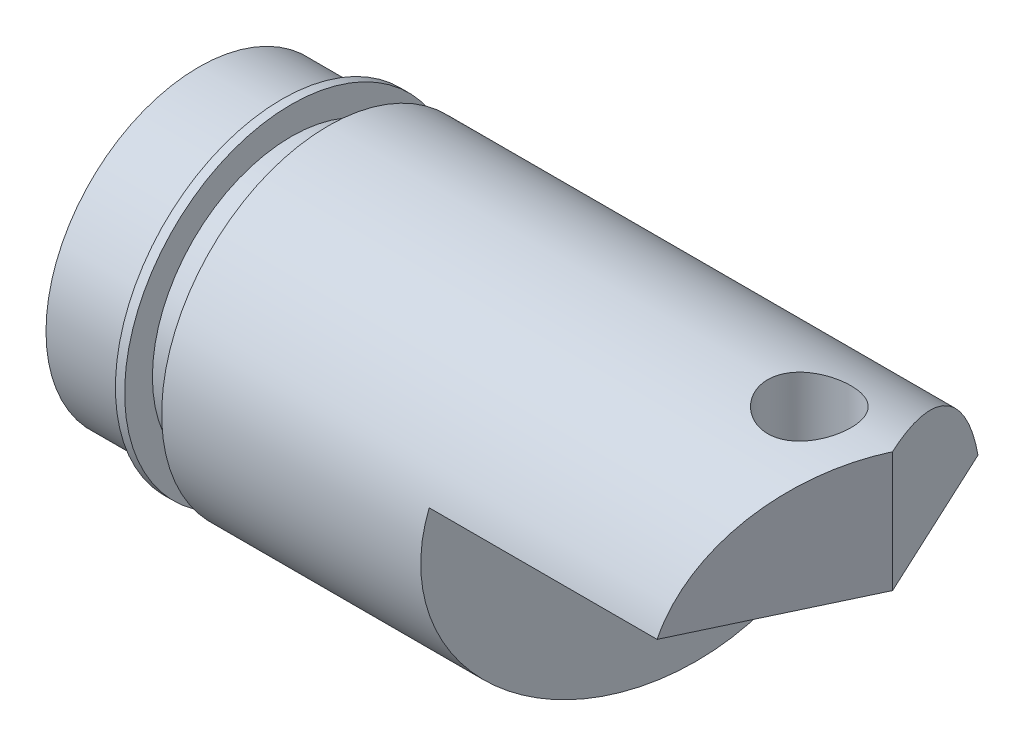
ISO-10303-21;
HEADER;
FILE_DESCRIPTION(('STEP AP214'),'2;1');
FILE_NAME('part.step','',(''),(''),'','','');
FILE_SCHEMA(('AUTOMOTIVE_DESIGN { 1 0 10303 214 1 1 1 1 }'));
ENDSEC;
DATA;
#1=APPLICATION_CONTEXT('core data for automotive mechanical design processes');
#2=APPLICATION_PROTOCOL_DEFINITION('international standard','automotive_design',2000,#1);
#3=PRODUCT_CONTEXT('',#1,'mechanical');
#4=PRODUCT('Part','Part','',(#3));
#5=PRODUCT_RELATED_PRODUCT_CATEGORY('part','',(#4));
#6=PRODUCT_DEFINITION_FORMATION('','',#4);
#7=PRODUCT_DEFINITION_CONTEXT('part definition',#1,'design');
#8=PRODUCT_DEFINITION('design','',#6,#7);
#9=PRODUCT_DEFINITION_SHAPE('','',#8);
#10=(LENGTH_UNIT() NAMED_UNIT(*) SI_UNIT(.MILLI.,.METRE.));
#11=(NAMED_UNIT(*) PLANE_ANGLE_UNIT() SI_UNIT($,.RADIAN.));
#12=(NAMED_UNIT(*) SI_UNIT($,.STERADIAN.) SOLID_ANGLE_UNIT());
#13=UNCERTAINTY_MEASURE_WITH_UNIT(LENGTH_MEASURE(1.E-05),#10,'distance_accuracy_value','');
#14=(GEOMETRIC_REPRESENTATION_CONTEXT(3) GLOBAL_UNCERTAINTY_ASSIGNED_CONTEXT((#13)) GLOBAL_UNIT_ASSIGNED_CONTEXT((#10,
#11,#12)) REPRESENTATION_CONTEXT('',''));
#15=CARTESIAN_POINT('',(0.,0.,0.));
#16=DIRECTION('',(0.,0.,1.));
#17=DIRECTION('',(1.,0.,0.));
#18=AXIS2_PLACEMENT_3D('',#15,#16,#17);
#19=CARTESIAN_POINT('',(150.,0.,0.));
#20=DIRECTION('',(1.,0.,0.));
#21=DIRECTION('',(0.,1.,0.));
#22=AXIS2_PLACEMENT_3D('',#19,#20,#21);
#23=CYLINDRICAL_SURFACE('',#22,36.);
#24=CARTESIAN_POINT('',(28.,0.,0.));
#25=DIRECTION('',(1.,0.,0.));
#26=DIRECTION('',(0.,1.,0.));
#27=AXIS2_PLACEMENT_3D('',#24,#25,#26);
#28=CIRCLE('',#27,36.);
#29=CARTESIAN_POINT('',(28.,36.,0.));
#30=VERTEX_POINT('',#29);
#31=EDGE_CURVE('E153',#30,#30,#28,.T.);
#32=ORIENTED_EDGE('',*,*,#31,.T.);
#33=EDGE_LOOP('',(#32));
#34=FACE_BOUND('',#33,.T.);
#35=CARTESIAN_POINT('',(123.,36.,0.));
#36=CARTESIAN_POINT('',(122.999992576533,36.0000044944164,-0.248708081107665));
#37=CARTESIAN_POINT('',(123.010310812333,35.997418850588,-0.497334927134101));
#38=CARTESIAN_POINT('',(123.05147979303,35.9871583606073,-0.992847512259112));
#39=CARTESIAN_POINT('',(123.082332880576,35.9794829338048,-1.23973304945848));
#40=CARTESIAN_POINT('',(123.164333573675,35.9592469135092,-1.72997199200645));
#41=CARTESIAN_POINT('',(123.215487472476,35.9466848051694,-1.97332427777547));
#42=CARTESIAN_POINT('',(123.337685873163,35.9170178569353,-2.45479492762603));
#43=CARTESIAN_POINT('',(123.408737711148,35.8999113416994,-2.69291132631911));
#44=CARTESIAN_POINT('',(123.570025589268,35.8616556614565,-3.16178775744111));
#45=CARTESIAN_POINT('',(123.660230807632,35.8405129969048,-3.39255893184381));
#46=CARTESIAN_POINT('',(123.859237553525,35.7947291894823,-3.8456782092311));
#47=CARTESIAN_POINT('',(123.968046042567,35.770086737546,-4.06802312084179));
#48=CARTESIAN_POINT('',(124.203389323214,35.7179784089056,-4.50265606051845));
#49=CARTESIAN_POINT('',(124.329916893428,35.6905136836236,-4.71494813867445));
#50=CARTESIAN_POINT('',(124.59990594184,35.6334671347439,-5.12831149613846));
#51=CARTESIAN_POINT('',(124.743375156719,35.6038843463445,-5.3293775867044));
#52=CARTESIAN_POINT('',(125.049040722956,35.5428333520078,-5.72252606101568));
#53=CARTESIAN_POINT('',(125.211534335297,35.5113403957843,-5.91437353986337));
#54=CARTESIAN_POINT('',(125.551872269155,35.4478549541394,-6.2836834894836));
#55=CARTESIAN_POINT('',(125.729709949448,35.4158626896911,-6.46115211985998));
#56=CARTESIAN_POINT('',(126.099727053217,35.3522276034191,-6.80072543740274));
#57=CARTESIAN_POINT('',(126.291913878228,35.3205849717377,-6.96282209620906));
#58=CARTESIAN_POINT('',(126.689224888148,35.2585571516821,-7.27040301697814));
#59=CARTESIAN_POINT('',(126.894344206234,35.2281714973212,-7.41589347102691));
#60=CARTESIAN_POINT('',(127.319482001813,35.1690527920878,-7.69141658700408));
#61=CARTESIAN_POINT('',(127.539680327774,35.1403521113973,-7.82117889987807));
#62=CARTESIAN_POINT('',(127.990522760713,35.0859781338499,-8.06159605565789));
#63=CARTESIAN_POINT('',(128.221162809222,35.0603036745144,-8.17225824323167));
#64=CARTESIAN_POINT('',(128.691379804367,35.0127442983362,-8.37367623614701));
#65=CARTESIAN_POINT('',(128.930957416218,34.9908596642538,-8.46443055629025));
#66=CARTESIAN_POINT('',(129.417309435166,34.9515601365013,-8.62527138426578));
#67=CARTESIAN_POINT('',(129.66408366972,34.9341451357671,-8.69535838716212));
#68=CARTESIAN_POINT('',(130.158003799092,34.9046329762828,-8.81307024625773));
#69=CARTESIAN_POINT('',(130.405043254017,34.8924362928045,-8.86111688015349));
#70=CARTESIAN_POINT('',(130.902476907251,34.8732389901334,-8.93637036715465));
#71=CARTESIAN_POINT('',(131.152871064852,34.8662383079481,-8.96357747290344));
#72=CARTESIAN_POINT('',(131.655115789811,34.8576521123172,-8.99690984404975));
#73=CARTESIAN_POINT('',(131.906966145298,34.8560658300219,-9.00303810266389));
#74=CARTESIAN_POINT('',(132.410267532501,34.8583561873088,-8.99416620227556));
#75=CARTESIAN_POINT('',(132.66171856972,34.8622327509305,-8.97916633705787));
#76=CARTESIAN_POINT('',(133.156210905136,34.8751663308839,-8.92879753627707));
#77=CARTESIAN_POINT('',(133.399307457731,34.8840943046791,-8.89393583920132));
#78=CARTESIAN_POINT('',(133.881709783103,34.9067723910135,-8.80450832611612));
#79=CARTESIAN_POINT('',(134.121014157804,34.9205242406588,-8.74993541177104));
#80=CARTESIAN_POINT('',(134.59405540334,34.9524453610949,-8.62153887898529));
#81=CARTESIAN_POINT('',(134.827793133983,34.9706139447673,-8.54771825481312));
#82=CARTESIAN_POINT('',(135.288184650311,35.0108492027718,-8.38139323227782));
#83=CARTESIAN_POINT('',(135.514838114114,35.0329160539243,-8.28888798637782));
#84=CARTESIAN_POINT('',(135.961813717021,35.0805656562831,-8.08486184192219));
#85=CARTESIAN_POINT('',(136.182049344485,35.1061815104471,-7.97315919624307));
#86=CARTESIAN_POINT('',(136.612364210327,35.1600387506006,-7.73219945063622));
#87=CARTESIAN_POINT('',(136.822443181354,35.1882802056464,-7.60294188895341));
#88=CARTESIAN_POINT('',(137.231142086715,35.2466158106245,-7.32774541133855));
#89=CARTESIAN_POINT('',(137.4297604731,35.2767102096995,-7.18180424989685));
#90=CARTESIAN_POINT('',(137.814271240451,35.3379359281938,-6.87421762063127));
#91=CARTESIAN_POINT('',(138.000163370913,35.3690672680063,-6.71257184382928));
#92=CARTESIAN_POINT('',(138.363173147926,35.4324303446844,-6.36978113050947));
#93=CARTESIAN_POINT('',(138.539888688096,35.4646681200777,-6.18821121181492));
#94=CARTESIAN_POINT('',(138.877440728774,35.528463439825,-5.81075838224585));
#95=CARTESIAN_POINT('',(139.038277296155,35.5600209870432,-5.6148755316553));
#96=CARTESIAN_POINT('',(139.342977953453,35.6215812890947,-5.21007238720521));
#97=CARTESIAN_POINT('',(139.486840910727,35.6515839400955,-5.0011512247248));
#98=CARTESIAN_POINT('',(139.756548223857,35.7091959905674,-4.57167947950408));
#99=CARTESIAN_POINT('',(139.882393254696,35.7368054796755,-4.35112933283051));
#100=CARTESIAN_POINT('',(140.115560275182,35.7889557320666,-3.89905149634634));
#101=CARTESIAN_POINT('',(140.222812305072,35.813484813278,-3.66748635232867));
#102=CARTESIAN_POINT('',(140.417339077324,35.8586481118262,-3.1958482586732));
#103=CARTESIAN_POINT('',(140.504621696191,35.8792838642378,-2.9557787067146));
#104=CARTESIAN_POINT('',(140.658547079378,35.9160806273048,-2.4687616040537));
#105=CARTESIAN_POINT('',(140.725188921551,35.9322414380345,-2.22181374659376));
#106=CARTESIAN_POINT('',(140.837253438622,35.9596175006157,-1.72288121573351));
#107=CARTESIAN_POINT('',(140.882676636658,35.9708328743945,-1.47089666667044));
#108=CARTESIAN_POINT('',(140.951017024578,35.9877707026607,-0.970294266785835));
#109=CARTESIAN_POINT('',(140.974480676372,35.9936264444568,-0.721755405302816));
#110=CARTESIAN_POINT('',(141.000681408636,36.0001680935616,-0.223521283164617));
#111=CARTESIAN_POINT('',(141.003418842699,36.0008540890671,0.0261739576897887));
#112=CARTESIAN_POINT('',(140.988144559454,35.997037224875,0.52486719008658));
#113=CARTESIAN_POINT('',(140.970134562504,35.9925347953969,0.773865237723523));
#114=CARTESIAN_POINT('',(140.913523269726,35.9784678199642,1.2693632222676));
#115=CARTESIAN_POINT('',(140.874922054408,35.9689032938019,1.51586316893823));
#116=CARTESIAN_POINT('',(140.778189714055,35.9451589919469,2.00090506817892));
#117=CARTESIAN_POINT('',(140.720361034563,35.9310507893372,2.23951094987882));
#118=CARTESIAN_POINT('',(140.585483293455,35.8985548611742,2.71101953711379));
#119=CARTESIAN_POINT('',(140.508427282619,35.8801655885007,2.94392014713149));
#120=CARTESIAN_POINT('',(140.335725577707,35.8396049466392,3.40230033622135));
#121=CARTESIAN_POINT('',(140.240085379678,35.8174346958665,3.62778208633466));
#122=CARTESIAN_POINT('',(140.030868653575,35.7698822335708,4.07001336809315));
#123=CARTESIAN_POINT('',(139.917285290557,35.744498798811,4.28675953251289));
#124=CARTESIAN_POINT('',(139.670892422831,35.6907255679094,4.71372564822919));
#125=CARTESIAN_POINT('',(139.537783869451,35.6622912987979,4.92376743082101));
#126=CARTESIAN_POINT('',(139.254728672287,35.6035380116113,5.33203934959501));
#127=CARTESIAN_POINT('',(139.104774442285,35.5732181471503,5.5302641021367));
#128=CARTESIAN_POINT('',(138.789059998823,35.511510420342,5.91357111708696));
#129=CARTESIAN_POINT('',(138.623297391244,35.4801223966906,6.09865138138459));
#130=CARTESIAN_POINT('',(138.277141381833,35.4171365103224,6.45438329043657));
#131=CARTESIAN_POINT('',(138.096754304922,35.3855387436885,6.625041108204));
#132=CARTESIAN_POINT('',(137.717750793312,35.3221872127429,6.95499967347827));
#133=CARTESIAN_POINT('',(137.518791308996,35.2904493060001,7.11390970868787));
#134=CARTESIAN_POINT('',(137.108041611164,35.2285522319199,7.41435316391705));
#135=CARTESIAN_POINT('',(136.896256177882,35.1983924841195,7.55589299901275));
#136=CARTESIAN_POINT('',(136.46112296814,35.1405053223955,7.82069490355043));
#137=CARTESIAN_POINT('',(136.237770993721,35.1127788015653,7.94395027321274));
#138=CARTESIAN_POINT('',(135.781190336022,35.0606046197724,8.17114386874968));
#139=CARTESIAN_POINT('',(135.547965667785,35.0361556424324,8.27508985646279));
#140=CARTESIAN_POINT('',(135.074567872402,34.9913957106248,8.46235474302151));
#141=CARTESIAN_POINT('',(134.834442954892,34.9710615529806,8.5457899087502));
#142=CARTESIAN_POINT('',(134.347674119132,34.934977795354,8.69212361438598));
#143=CARTESIAN_POINT('',(134.101030210019,34.9192281889464,8.75502218307483));
#144=CARTESIAN_POINT('',(133.603082955044,34.8928084117383,8.85973145309088));
#145=CARTESIAN_POINT('',(133.351780472944,34.8821373089116,8.90154602391624));
#146=CARTESIAN_POINT('',(132.846367810008,34.8662093086082,8.96373158731472));
#147=CARTESIAN_POINT('',(132.592257696871,34.8609522808712,8.98410309579834));
#148=CARTESIAN_POINT('',(132.090497205908,34.8560908378719,9.00294499839541));
#149=CARTESIAN_POINT('',(131.842871167285,34.856328242989,9.00202825877664));
#150=CARTESIAN_POINT('',(131.348600783328,34.8620604188912,8.97980375004407));
#151=CARTESIAN_POINT('',(131.101956418233,34.8675550832951,8.95849639353605));
#152=CARTESIAN_POINT('',(130.611432302483,34.8836355240544,8.89567423568658));
#153=CARTESIAN_POINT('',(130.367552478495,34.8942211650369,8.85415997166199));
#154=CARTESIAN_POINT('',(129.88427908512,34.9201667978323,8.7512719563679));
#155=CARTESIAN_POINT('',(129.644885538229,34.935526813579,8.68989810554335));
#156=CARTESIAN_POINT('',(129.173704616352,34.970460097341,8.54822807749696));
#157=CARTESIAN_POINT('',(128.941879419746,34.9900067801309,8.46805100856149));
#158=CARTESIAN_POINT('',(128.485757621239,35.0328177477336,8.289157743013));
#159=CARTESIAN_POINT('',(128.261463773477,35.0560833749921,8.19043484955846));
#160=CARTESIAN_POINT('',(127.821961093139,35.105673744378,7.97520272396412));
#161=CARTESIAN_POINT('',(127.606751434589,35.1319982075628,7.85869511335139));
#162=CARTESIAN_POINT('',(127.186739744163,35.1869878821311,7.60869624151775));
#163=CARTESIAN_POINT('',(126.981938212744,35.2156532058982,7.47520416470808));
#164=CARTESIAN_POINT('',(126.5788222623,35.2753227784394,7.18843517222198));
#165=CARTESIAN_POINT('',(126.380816367522,35.3063685312137,7.03473303398123));
#166=CARTESIAN_POINT('',(125.998377933306,35.369250497551,6.71142551676187));
#167=CARTESIAN_POINT('',(125.813945606682,35.401086723497,6.54181988853239));
#168=CARTESIAN_POINT('',(125.459807030357,35.4646833770241,6.18777665101927));
#169=CARTESIAN_POINT('',(125.290104345433,35.4964437844574,6.00333547202093));
#170=CARTESIAN_POINT('',(124.966599780176,35.5590147074534,5.62085561849887));
#171=CARTESIAN_POINT('',(124.812797565338,35.5898252429895,5.42281723017262));
#172=CARTESIAN_POINT('',(124.519465282284,35.6502091902369,5.0106629084975));
#173=CARTESIAN_POINT('',(124.380249070444,35.6797495054594,4.79631855931569));
#174=CARTESIAN_POINT('',(124.120460095943,35.7361311958794,4.35638506636291));
#175=CARTESIAN_POINT('',(123.999880500691,35.7629735589371,4.13080008395693));
#176=CARTESIAN_POINT('',(123.778275768142,35.8131971567822,3.66995539206402));
#177=CARTESIAN_POINT('',(123.677242190377,35.8365798844979,3.43469991199652));
#178=CARTESIAN_POINT('',(123.495500467065,35.8792244382749,2.95618502779111));
#179=CARTESIAN_POINT('',(123.414789255375,35.8984868859188,2.71292683733396));
#180=CARTESIAN_POINT('',(123.230650718983,35.9428574352683,2.06666445691952));
#181=CARTESIAN_POINT('',(123.144306933196,35.9641522127952,1.65838720894222));
#182=CARTESIAN_POINT('',(123.028989947834,35.9927192040657,0.833330253711373));
#183=CARTESIAN_POINT('',(123.000012433267,35.9999924724822,0.416551188332662));
#184=CARTESIAN_POINT('',(123.,36.,0.));
#185=B_SPLINE_CURVE_WITH_KNOTS('',3,(#35,#36,#37,#38,#39,#40,#41,#42,#43,#44,#45,#46,#47,#48,
#49,#50,#51,#52,#53,#54,#55,#56,#57,#58,#59,#60,#61,#62,#63,#64,#65,#66,#67,#68,#69,#70,#71,#72,
#73,#74,#75,#76,#77,#78,#79,#80,#81,#82,#83,#84,#85,#86,#87,#88,#89,#90,#91,#92,#93,#94,#95,#96,
#97,#98,#99,#100,#101,#102,#103,#104,#105,#106,#107,#108,#109,#110,#111,#112,#113,#114,#115,
#116,#117,#118,#119,#120,#121,#122,#123,#124,#125,#126,#127,#128,#129,#130,#131,#132,#133,#134,
#135,#136,#137,#138,#139,#140,#141,#142,#143,#144,#145,#146,#147,#148,#149,#150,#151,#152,#153,
#154,#155,#156,#157,#158,#159,#160,#161,#162,#163,#164,#165,#166,#167,#168,#169,#170,#171,#172,
#173,#174,#175,#176,#177,#178,#179,#180,#181,#182,#183,#184),.UNSPECIFIED.,.T.,.F.,(4,2,2,2,2,2,
2,2,2,2,2,2,2,2,2,2,2,2,2,2,2,2,2,2,2,2,2,2,2,2,2,2,2,2,2,2,2,2,2,2,2,2,2,2,2,2,2,2,2,2,2,2,2,2,
2,2,2,2,2,2,2,2,2,2,2,2,2,2,2,2,2,2,2,2,4),(0.,0.745757180412464,1.49159945258445,
2.23767311659299,2.98402221081554,3.72917925528558,4.4746157570455,5.21974933641206,
5.96522451887755,6.72448606463823,7.4834206194622,8.24274938691306,9.00179408606905,
9.77244404706887,10.5427970026942,11.3132074098819,12.0835993611912,12.8385611508705,
13.5935137877931,14.3483592162865,15.1031941488214,15.8395645049813,16.57620030512,
17.3127215788678,18.0492762688222,18.7932326068073,19.5372085172113,20.2812846803429,
21.0253754856551,21.790712912675,22.5560471163917,23.321432361715,24.0867889268015,
24.8549655739169,25.6228387058707,26.3907461383228,27.1586346373434,27.9068622741717,
28.6550771460639,29.4032299811339,30.1513798910187,30.8882782031936,31.6254432349023,
32.3623905898613,33.0996193440659,33.8496229226199,34.5999656192735,35.3504221334492,
36.1005557973338,36.8694474943826,37.6380543681205,38.4069421822215,39.1755202526674,
39.9396355636027,40.7037498036355,41.4677237564301,42.2316793279322,42.9736694242147,
43.7156445065854,44.4575998603595,45.1995589335744,45.9369393238962,46.6745864936651,
47.4121664483527,48.1497818347763,48.9066360019176,49.6635020330018,50.420550728344,
51.1775834940176,51.9485144173312,52.7191620266119,53.4894761041432,54.2596738905627,
55.5088066378108,56.7578454238643),.UNSPECIFIED.);
#186=CARTESIAN_POINT('',(123.,36.,0.));
#187=VERTEX_POINT('',#186);
#188=EDGE_CURVE('E94',#187,#187,#185,.T.);
#189=ORIENTED_EDGE('',*,*,#188,.T.);
#190=EDGE_LOOP('',(#189));
#191=FACE_BOUND('',#190,.T.);
#192=CARTESIAN_POINT('',(150.,0.,0.));
#193=DIRECTION('',(0.904396001462135,0.,0.426694120582064));
#194=DIRECTION('',(0.426694120582064,0.,-0.904396001462135));
#195=AXIS2_PLACEMENT_3D('',#192,#193,#194);
#196=ELLIPSE('',#195,39.8055718311435,36.);
#197=CARTESIAN_POINT('',(133.683627372557,10.,34.5832329315812));
#198=VERTEX_POINT('',#197);
#199=CARTESIAN_POINT('',(150.,36.,0.));
#200=VERTEX_POINT('',#199);
#201=EDGE_CURVE('E55',#198,#200,#196,.F.);
#202=ORIENTED_EDGE('',*,*,#201,.T.);
#203=CARTESIAN_POINT('',(150.,0.,0.));
#204=DIRECTION('',(0.906307787034833,0.,-0.422618261744596));
#205=DIRECTION('',(0.422618261744596,0.,0.906307787034833));
#206=AXIS2_PLACEMENT_3D('',#203,#204,#205);
#207=ELLIPSE('',#206,39.7216050827293,36.);
#208=CARTESIAN_POINT('',(133.873573640065,10.,-34.5832329315811));
#209=VERTEX_POINT('',#208);
#210=EDGE_CURVE('E83',#200,#209,#207,.F.);
#211=ORIENTED_EDGE('',*,*,#210,.T.);
#212=DIRECTION('',(1.,0.,0.));
#213=VECTOR('',#212,1.);
#214=CARTESIAN_POINT('',(150.,10.,-34.5832329315812));
#215=LINE('',#214,#213);
#216=CARTESIAN_POINT('',(104.586776271715,10.,-34.5832329315812));
#217=VERTEX_POINT('',#216);
#218=EDGE_CURVE('E11',#209,#217,#215,.F.);
#219=ORIENTED_EDGE('',*,*,#218,.T.);
#220=CARTESIAN_POINT('',(94.5000000000042,0.,0.));
#221=DIRECTION('',(-0.96,0.,-0.28));
#222=DIRECTION('',(0.28,0.,-0.96));
#223=AXIS2_PLACEMENT_3D('',#220,#221,#222);
#224=ELLIPSE('',#223,37.5,36.);
#225=CARTESIAN_POINT('',(84.413223728293,9.99999999999999,34.5832329315812));
#226=VERTEX_POINT('',#225);
#227=EDGE_CURVE('E48',#226,#217,#224,.F.);
#228=ORIENTED_EDGE('',*,*,#227,.F.);
#229=DIRECTION('',(1.,0.,0.));
#230=VECTOR('',#229,1.);
#231=CARTESIAN_POINT('',(150.,10.,34.5832329315812));
#232=LINE('',#231,#230);
#233=EDGE_CURVE('E62',#226,#198,#232,.T.);
#234=ORIENTED_EDGE('',*,*,#233,.T.);
#235=EDGE_LOOP('',(#202,#211,#219,#228,#234));
#236=FACE_BOUND('',#235,.T.);
#237=ADVANCED_FACE('F40',(#34,#191,#236),#23,.T.);
#238=CARTESIAN_POINT('',(150.,10.,-36.));
#239=DIRECTION('',(0.,-1.,0.));
#240=DIRECTION('',(0.,0.,-1.));
#241=AXIS2_PLACEMENT_3D('',#238,#239,#240);
#242=PLANE('',#241);
#243=CARTESIAN_POINT('',(132.,10.,0.));
#244=DIRECTION('',(0.,1.,0.));
#245=DIRECTION('',(0.,0.,1.));
#246=AXIS2_PLACEMENT_3D('',#243,#244,#245);
#247=CIRCLE('',#246,9.);
#248=CARTESIAN_POINT('',(132.,10.,9.));
#249=VERTEX_POINT('',#248);
#250=EDGE_CURVE('E91',#249,#249,#247,.T.);
#251=ORIENTED_EDGE('',*,*,#250,.T.);
#252=EDGE_LOOP('',(#251));
#253=FACE_BOUND('',#252,.T.);
#254=ORIENTED_EDGE('',*,*,#218,.F.);
#255=DIRECTION('',(0.422618261744596,0.,0.906307787034833));
#256=VECTOR('',#255,1.);
#257=CARTESIAN_POINT('',(150.,10.,0.));
#258=LINE('',#257,#256);
#259=CARTESIAN_POINT('',(150.,10.,0.));
#260=VERTEX_POINT('',#259);
#261=EDGE_CURVE('E78',#209,#260,#258,.T.);
#262=ORIENTED_EDGE('',*,*,#261,.T.);
#263=DIRECTION('',(-0.426694120582064,0.,0.904396001462136));
#264=VECTOR('',#263,1.);
#265=CARTESIAN_POINT('',(127.125341529967,10.,48.4837935589286));
#266=LINE('',#265,#264);
#267=EDGE_CURVE('E73',#260,#198,#266,.T.);
#268=ORIENTED_EDGE('',*,*,#267,.T.);
#269=ORIENTED_EDGE('',*,*,#233,.F.);
#270=DIRECTION('',(-0.28,0.,0.96));
#271=VECTOR('',#270,1.);
#272=CARTESIAN_POINT('',(105.000000000004,10.,-36.));
#273=LINE('',#272,#271);
#274=EDGE_CURVE('E101',#217,#226,#273,.T.);
#275=ORIENTED_EDGE('',*,*,#274,.F.);
#276=EDGE_LOOP('',(#254,#262,#268,#269,#275));
#277=FACE_BOUND('',#276,.T.);
#278=ADVANCED_FACE('F86',(#253,#277),#242,.T.);
#279=CARTESIAN_POINT('',(150.,0.,0.));
#280=DIRECTION('',(1.,0.,0.));
#281=DIRECTION('',(0.,1.,0.));
#282=AXIS2_PLACEMENT_3D('',#279,#280,#281);
#283=CYLINDRICAL_SURFACE('',#282,33.);
#284=CARTESIAN_POINT('',(0.,0.,0.));
#285=DIRECTION('',(1.,0.,0.));
#286=DIRECTION('',(0.,1.,0.));
#287=AXIS2_PLACEMENT_3D('',#284,#285,#286);
#288=CIRCLE('',#287,33.);
#289=CARTESIAN_POINT('',(0.,33.,0.));
#290=VERTEX_POINT('',#289);
#291=EDGE_CURVE('E158',#290,#290,#288,.T.);
#292=ORIENTED_EDGE('',*,*,#291,.T.);
#293=EDGE_LOOP('',(#292));
#294=FACE_BOUND('',#293,.T.);
#295=CARTESIAN_POINT('',(18.,0.,0.));
#296=DIRECTION('',(1.,0.,0.));
#297=DIRECTION('',(0.,1.,0.));
#298=AXIS2_PLACEMENT_3D('',#295,#296,#297);
#299=CIRCLE('',#298,33.);
#300=CARTESIAN_POINT('',(18.,33.,0.));
#301=VERTEX_POINT('',#300);
#302=EDGE_CURVE('E186',#301,#301,#299,.T.);
#303=ORIENTED_EDGE('',*,*,#302,.F.);
#304=EDGE_LOOP('',(#303));
#305=FACE_BOUND('',#304,.T.);
#306=ADVANCED_FACE('F42',(#294,#305),#283,.T.);
#307=CARTESIAN_POINT('',(0.,21.,0.));
#308=DIRECTION('',(-1.,0.,0.));
#309=DIRECTION('',(0.,-1.,0.));
#310=AXIS2_PLACEMENT_3D('',#307,#308,#309);
#311=PLANE('',#310);
#312=CARTESIAN_POINT('',(0.,0.,0.));
#313=DIRECTION('',(1.,0.,0.));
#314=DIRECTION('',(0.,1.,0.));
#315=AXIS2_PLACEMENT_3D('',#312,#313,#314);
#316=CIRCLE('',#315,21.);
#317=CARTESIAN_POINT('',(0.,21.,0.));
#318=VERTEX_POINT('',#317);
#319=EDGE_CURVE('E161',#318,#318,#316,.T.);
#320=ORIENTED_EDGE('',*,*,#319,.T.);
#321=EDGE_LOOP('',(#320));
#322=FACE_BOUND('',#321,.T.);
#323=ORIENTED_EDGE('',*,*,#291,.F.);
#324=EDGE_LOOP('',(#323));
#325=FACE_BOUND('',#324,.T.);
#326=ADVANCED_FACE('F192',(#322,#325),#311,.T.);
#327=CARTESIAN_POINT('',(150.,0.,0.));
#328=DIRECTION('',(1.,0.,0.));
#329=DIRECTION('',(0.,1.,0.));
#330=AXIS2_PLACEMENT_3D('',#327,#328,#329);
#331=CYLINDRICAL_SURFACE('',#330,21.);
#332=CARTESIAN_POINT('',(36.,0.,0.));
#333=DIRECTION('',(1.,0.,0.));
#334=DIRECTION('',(0.,1.,0.));
#335=AXIS2_PLACEMENT_3D('',#332,#333,#334);
#336=CIRCLE('',#335,21.);
#337=CARTESIAN_POINT('',(36.,21.,0.));
#338=VERTEX_POINT('',#337);
#339=EDGE_CURVE('E166',#338,#338,#336,.T.);
#340=ORIENTED_EDGE('',*,*,#339,.T.);
#341=EDGE_LOOP('',(#340));
#342=FACE_BOUND('',#341,.T.);
#343=ORIENTED_EDGE('',*,*,#319,.F.);
#344=EDGE_LOOP('',(#343));
#345=FACE_BOUND('',#344,.T.);
#346=ADVANCED_FACE('F197',(#342,#345),#331,.F.);
#347=CARTESIAN_POINT('',(36.,18.9999999999608,0.));
#348=DIRECTION('',(-1.,0.,0.));
#349=DIRECTION('',(0.,-1.,0.));
#350=AXIS2_PLACEMENT_3D('',#347,#348,#349);
#351=PLANE('',#350);
#352=CARTESIAN_POINT('',(36.,0.,0.));
#353=DIRECTION('',(1.,0.,0.));
#354=DIRECTION('',(0.,1.,0.));
#355=AXIS2_PLACEMENT_3D('',#352,#353,#354);
#356=CIRCLE('',#355,18.9999999999609);
#357=CARTESIAN_POINT('',(36.,18.9999999999608,0.));
#358=VERTEX_POINT('',#357);
#359=EDGE_CURVE('E169',#358,#358,#356,.T.);
#360=ORIENTED_EDGE('',*,*,#359,.T.);
#361=EDGE_LOOP('',(#360));
#362=FACE_BOUND('',#361,.T.);
#363=ORIENTED_EDGE('',*,*,#339,.F.);
#364=EDGE_LOOP('',(#363));
#365=FACE_BOUND('',#364,.T.);
#366=ADVANCED_FACE('F204',(#362,#365),#351,.T.);
#367=CARTESIAN_POINT('',(36.,0.,0.));
#368=DIRECTION('',(-1.,0.,0.));
#369=DIRECTION('',(0.,-1.,0.));
#370=AXIS2_PLACEMENT_3D('',#367,#368,#369);
#371=CONICAL_SURFACE('',#370,18.9999999999609,0.128467369718997);
#372=CARTESIAN_POINT('',(67.9217143976972,0.,0.));
#373=DIRECTION('',(1.,0.,0.));
#374=DIRECTION('',(0.,1.,0.));
#375=AXIS2_PLACEMENT_3D('',#372,#373,#374);
#376=CIRCLE('',#375,14.8763911542009);
#377=CARTESIAN_POINT('',(67.9217143976972,14.8763911542009,0.));
#378=VERTEX_POINT('',#377);
#379=EDGE_CURVE('E172',#378,#378,#376,.T.);
#380=ORIENTED_EDGE('',*,*,#379,.T.);
#381=EDGE_LOOP('',(#380));
#382=FACE_BOUND('',#381,.T.);
#383=ORIENTED_EDGE('',*,*,#359,.F.);
#384=EDGE_LOOP('',(#383));
#385=FACE_BOUND('',#384,.T.);
#386=ADVANCED_FACE('F142',(#382,#385),#371,.F.);
#387=CARTESIAN_POINT('',(65.9999999943345,0.,0.));
#388=DIRECTION('',(1.,0.,0.));
#389=DIRECTION('',(0.,1.,0.));
#390=AXIS2_PLACEMENT_3D('',#387,#388,#389);
#391=SPHERICAL_SURFACE('',#390,15.0000000006959);
#392=ORIENTED_EDGE('',*,*,#379,.F.);
#393=EDGE_LOOP('',(#392));
#394=FACE_BOUND('',#393,.T.);
#395=ADVANCED_FACE('F137',(#394),#391,.F.);
#396=CARTESIAN_POINT('',(28.,30.,0.));
#397=DIRECTION('',(-1.,0.,0.));
#398=DIRECTION('',(0.,-1.,0.));
#399=AXIS2_PLACEMENT_3D('',#396,#397,#398);
#400=PLANE('',#399);
#401=CARTESIAN_POINT('',(28.,0.,0.));
#402=DIRECTION('',(1.,0.,0.));
#403=DIRECTION('',(0.,1.,0.));
#404=AXIS2_PLACEMENT_3D('',#401,#402,#403);
#405=CIRCLE('',#404,30.);
#406=CARTESIAN_POINT('',(28.,30.,0.));
#407=VERTEX_POINT('',#406);
#408=EDGE_CURVE('E176',#407,#407,#405,.T.);
#409=ORIENTED_EDGE('',*,*,#408,.T.);
#410=EDGE_LOOP('',(#409));
#411=FACE_BOUND('',#410,.T.);
#412=ORIENTED_EDGE('',*,*,#31,.F.);
#413=EDGE_LOOP('',(#412));
#414=FACE_BOUND('',#413,.T.);
#415=ADVANCED_FACE('F134',(#411,#414),#400,.T.);
#416=CARTESIAN_POINT('',(150.,0.,0.));
#417=DIRECTION('',(1.,0.,0.));
#418=DIRECTION('',(0.,1.,0.));
#419=AXIS2_PLACEMENT_3D('',#416,#417,#418);
#420=CYLINDRICAL_SURFACE('',#419,30.);
#421=CARTESIAN_POINT('',(20.,0.,0.));
#422=DIRECTION('',(1.,0.,0.));
#423=DIRECTION('',(0.,1.,0.));
#424=AXIS2_PLACEMENT_3D('',#421,#422,#423);
#425=CIRCLE('',#424,30.);
#426=CARTESIAN_POINT('',(20.,30.,0.));
#427=VERTEX_POINT('',#426);
#428=EDGE_CURVE('E178',#427,#427,#425,.T.);
#429=ORIENTED_EDGE('',*,*,#428,.T.);
#430=EDGE_LOOP('',(#429));
#431=FACE_BOUND('',#430,.T.);
#432=ORIENTED_EDGE('',*,*,#408,.F.);
#433=EDGE_LOOP('',(#432));
#434=FACE_BOUND('',#433,.T.);
#435=ADVANCED_FACE('F131',(#431,#434),#420,.T.);
#436=CARTESIAN_POINT('',(20.,36.,0.));
#437=DIRECTION('',(1.,0.,0.));
#438=DIRECTION('',(0.,1.,0.));
#439=AXIS2_PLACEMENT_3D('',#436,#437,#438);
#440=PLANE('',#439);
#441=CARTESIAN_POINT('',(20.,0.,0.));
#442=DIRECTION('',(1.,0.,0.));
#443=DIRECTION('',(0.,1.,0.));
#444=AXIS2_PLACEMENT_3D('',#441,#442,#443);
#445=CIRCLE('',#444,36.);
#446=CARTESIAN_POINT('',(20.,36.,0.));
#447=VERTEX_POINT('',#446);
#448=EDGE_CURVE('E181',#447,#447,#445,.T.);
#449=ORIENTED_EDGE('',*,*,#448,.T.);
#450=EDGE_LOOP('',(#449));
#451=FACE_BOUND('',#450,.T.);
#452=ORIENTED_EDGE('',*,*,#428,.F.);
#453=EDGE_LOOP('',(#452));
#454=FACE_BOUND('',#453,.T.);
#455=ADVANCED_FACE('F127',(#451,#454),#440,.T.);
#456=CARTESIAN_POINT('',(150.,0.,0.));
#457=DIRECTION('',(1.,0.,0.));
#458=DIRECTION('',(0.,1.,0.));
#459=AXIS2_PLACEMENT_3D('',#456,#457,#458);
#460=CYLINDRICAL_SURFACE('',#459,36.);
#461=CARTESIAN_POINT('',(18.,0.,0.));
#462=DIRECTION('',(1.,0.,0.));
#463=DIRECTION('',(0.,1.,0.));
#464=AXIS2_PLACEMENT_3D('',#461,#462,#463);
#465=CIRCLE('',#464,36.);
#466=CARTESIAN_POINT('',(18.,36.,0.));
#467=VERTEX_POINT('',#466);
#468=EDGE_CURVE('E184',#467,#467,#465,.T.);
#469=ORIENTED_EDGE('',*,*,#468,.T.);
#470=EDGE_LOOP('',(#469));
#471=FACE_BOUND('',#470,.T.);
#472=ORIENTED_EDGE('',*,*,#448,.F.);
#473=EDGE_LOOP('',(#472));
#474=FACE_BOUND('',#473,.T.);
#475=ADVANCED_FACE('F123',(#471,#474),#460,.T.);
#476=CARTESIAN_POINT('',(18.,33.,0.));
#477=DIRECTION('',(-1.,0.,0.));
#478=DIRECTION('',(0.,-1.,0.));
#479=AXIS2_PLACEMENT_3D('',#476,#477,#478);
#480=PLANE('',#479);
#481=ORIENTED_EDGE('',*,*,#302,.T.);
#482=EDGE_LOOP('',(#481));
#483=FACE_BOUND('',#482,.T.);
#484=ORIENTED_EDGE('',*,*,#468,.F.);
#485=EDGE_LOOP('',(#484));
#486=FACE_BOUND('',#485,.T.);
#487=ADVANCED_FACE('F119',(#483,#486),#480,.T.);
#488=CARTESIAN_POINT('',(105.000000000004,-36.,-36.));
#489=DIRECTION('',(-0.96,0.,-0.28));
#490=DIRECTION('',(-0.28,0.,0.96));
#491=AXIS2_PLACEMENT_3D('',#488,#489,#490);
#492=PLANE('',#491);
#493=ORIENTED_EDGE('',*,*,#227,.T.);
#494=ORIENTED_EDGE('',*,*,#274,.T.);
#495=EDGE_LOOP('',(#493,#494));
#496=FACE_BOUND('',#495,.T.);
#497=ADVANCED_FACE('F111',(#496),#492,.F.);
#498=CARTESIAN_POINT('',(132.,36.,0.));
#499=DIRECTION('',(0.,-1.,0.));
#500=DIRECTION('',(0.,0.,-1.));
#501=AXIS2_PLACEMENT_3D('',#498,#499,#500);
#502=CYLINDRICAL_SURFACE('',#501,9.);
#503=ORIENTED_EDGE('',*,*,#188,.F.);
#504=EDGE_LOOP('',(#503));
#505=FACE_BOUND('',#504,.T.);
#506=ORIENTED_EDGE('',*,*,#250,.F.);
#507=EDGE_LOOP('',(#506));
#508=FACE_BOUND('',#507,.T.);
#509=ADVANCED_FACE('F106',(#505,#508),#502,.F.);
#510=CARTESIAN_POINT('',(150.,36.,0.));
#511=DIRECTION('',(0.906307787034833,0.,-0.422618261744596));
#512=DIRECTION('',(-0.422618261744596,0.,-0.906307787034833));
#513=AXIS2_PLACEMENT_3D('',#510,#511,#512);
#514=PLANE('',#513);
#515=DIRECTION('',(0.,-1.,0.));
#516=VECTOR('',#515,1.);
#517=CARTESIAN_POINT('',(150.,36.,0.));
#518=LINE('',#517,#516);
#519=EDGE_CURVE('E76',#200,#260,#518,.T.);
#520=ORIENTED_EDGE('',*,*,#519,.T.);
#521=ORIENTED_EDGE('',*,*,#261,.F.);
#522=ORIENTED_EDGE('',*,*,#210,.F.);
#523=EDGE_LOOP('',(#520,#521,#522));
#524=FACE_BOUND('',#523,.T.);
#525=ADVANCED_FACE('F81',(#524),#514,.T.);
#526=CARTESIAN_POINT('',(127.125341529967,36.,48.4837935589286));
#527=DIRECTION('',(0.904396001462135,0.,0.426694120582064));
#528=DIRECTION('',(0.426694120582064,0.,-0.904396001462135));
#529=AXIS2_PLACEMENT_3D('',#526,#527,#528);
#530=PLANE('',#529);
#531=ORIENTED_EDGE('',*,*,#267,.F.);
#532=ORIENTED_EDGE('',*,*,#519,.F.);
#533=ORIENTED_EDGE('',*,*,#201,.F.);
#534=EDGE_LOOP('',(#531,#532,#533));
#535=FACE_BOUND('',#534,.T.);
#536=ADVANCED_FACE('F75',(#535),#530,.T.);
#537=CLOSED_SHELL('',(#237,#278,#306,#326,#346,#366,#386,#395,#415,#435,#455,#475,#487,#497,
#509,#525,#536));
#538=MANIFOLD_SOLID_BREP('B2',#537);
#539=ADVANCED_BREP_SHAPE_REPRESENTATION('',(#18,#538),#14);
#540=SHAPE_DEFINITION_REPRESENTATION(#9,#539);
ENDSEC;
END-ISO-10303-21;
